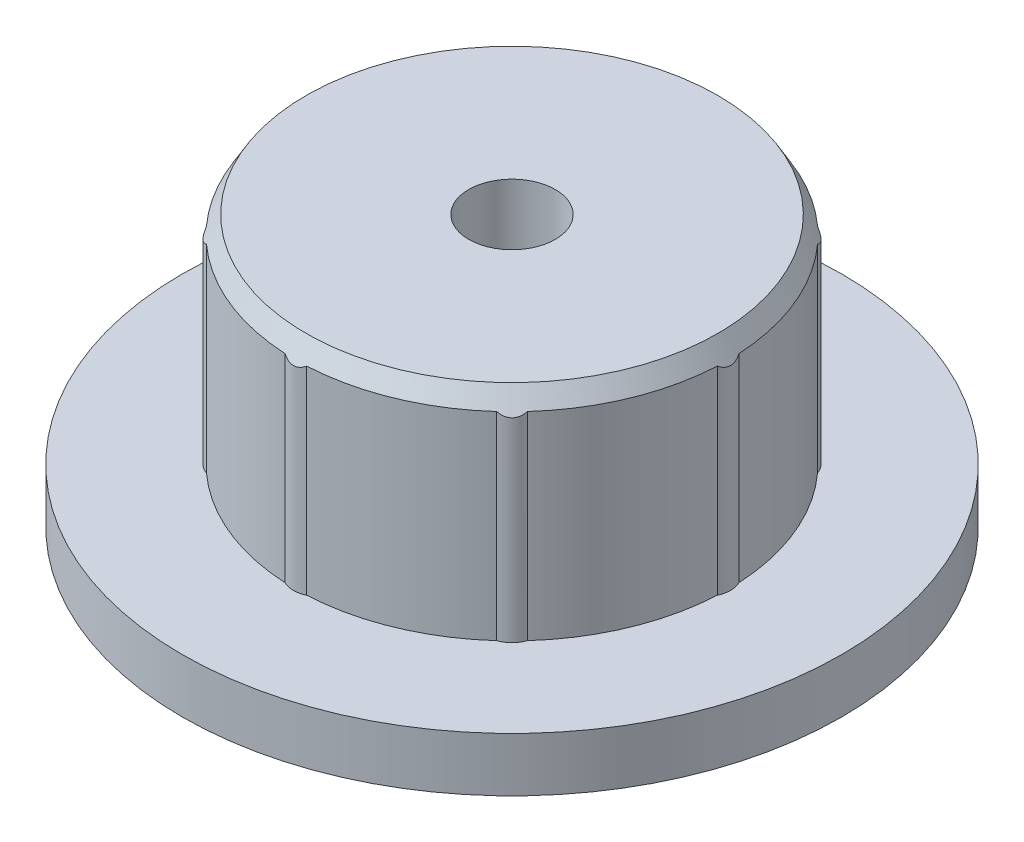
ISO-10303-21;
HEADER;
FILE_DESCRIPTION(('STEP AP214'),'2;1');
FILE_NAME('part.step','',(''),(''),'','','');
FILE_SCHEMA(('AUTOMOTIVE_DESIGN { 1 0 10303 214 1 1 1 1 }'));
ENDSEC;
DATA;
#1=APPLICATION_CONTEXT('core data for automotive mechanical design processes');
#2=APPLICATION_PROTOCOL_DEFINITION('international standard','automotive_design',2000,#1);
#3=PRODUCT_CONTEXT('',#1,'mechanical');
#4=PRODUCT('Part','Part','',(#3));
#5=PRODUCT_RELATED_PRODUCT_CATEGORY('part','',(#4));
#6=PRODUCT_DEFINITION_FORMATION('','',#4);
#7=PRODUCT_DEFINITION_CONTEXT('part definition',#1,'design');
#8=PRODUCT_DEFINITION('design','',#6,#7);
#9=PRODUCT_DEFINITION_SHAPE('','',#8);
#10=(LENGTH_UNIT() NAMED_UNIT(*) SI_UNIT(.MILLI.,.METRE.));
#11=(NAMED_UNIT(*) PLANE_ANGLE_UNIT() SI_UNIT($,.RADIAN.));
#12=(NAMED_UNIT(*) SI_UNIT($,.STERADIAN.) SOLID_ANGLE_UNIT());
#13=UNCERTAINTY_MEASURE_WITH_UNIT(LENGTH_MEASURE(1.E-05),#10,'distance_accuracy_value','');
#14=(GEOMETRIC_REPRESENTATION_CONTEXT(3) GLOBAL_UNCERTAINTY_ASSIGNED_CONTEXT((#13)) GLOBAL_UNIT_ASSIGNED_CONTEXT((#10,
#11,#12)) REPRESENTATION_CONTEXT('',''));
#15=CARTESIAN_POINT('',(0.,0.,0.));
#16=DIRECTION('',(0.,0.,1.));
#17=DIRECTION('',(1.,0.,0.));
#18=AXIS2_PLACEMENT_3D('',#15,#16,#17);
#19=CARTESIAN_POINT('',(0.,20.,-17.8654244589449));
#20=DIRECTION('',(0.,-1.,0.));
#21=DIRECTION('',(0.,0.,-1.));
#22=AXIS2_PLACEMENT_3D('',#19,#20,#21);
#23=CYLINDRICAL_SURFACE('',#22,2.33457554105512);
#24=CARTESIAN_POINT('',(1.00019999999913,18.3465568635732,-19.9748895373225));
#25=CARTESIAN_POINT('',(0.936778937973476,18.3000059783888,-20.0049752769249));
#26=CARTESIAN_POINT('',(0.869869912967122,18.2564678303075,-20.0331776508218));
#27=CARTESIAN_POINT('',(0.728845285712576,18.1772155107456,-20.0845929601786));
#28=CARTESIAN_POINT('',(0.65466279754121,18.1415861811692,-20.107751744946));
#29=CARTESIAN_POINT('',(0.499656897997748,18.0807913397925,-20.1473117926902));
#30=CARTESIAN_POINT('',(0.418791818863089,18.0556985122212,-20.1636661093868));
#31=CARTESIAN_POINT('',(0.253155513709557,18.0187956663927,-20.1877302835464));
#32=CARTESIAN_POINT('',(0.168404458060747,18.0069237028639,-20.1954804544957));
#33=CARTESIAN_POINT('',(0.0054196616133081,17.9980253641132,-20.2012889261277));
#34=CARTESIAN_POINT('',(-0.072718913273675,17.9997660114449,-20.2001521732146));
#35=CARTESIAN_POINT('',(-0.227400467730402,18.015026362725,-20.1901924466268));
#36=CARTESIAN_POINT('',(-0.303941554463938,18.0285593085791,-20.1813608321755));
#37=CARTESIAN_POINT('',(-0.448565408111955,18.0650025949673,-20.1576031639655));
#38=CARTESIAN_POINT('',(-0.516878976354796,18.0872863483881,-20.14308447122));
#39=CARTESIAN_POINT('',(-0.649097768835284,18.1396865669246,-20.1089888452164));
#40=CARTESIAN_POINT('',(-0.713000248564872,18.1698078538274,-20.0894087981738));
#41=CARTESIAN_POINT('',(-0.814192358588953,18.224629572099,-20.053829140502));
#42=CARTESIAN_POINT('',(-0.8529218819037,18.2474973645416,-20.0390008426883));
#43=CARTESIAN_POINT('',(-0.928168459614842,18.2954435604405,-20.0079445847695));
#44=CARTESIAN_POINT('',(-0.964693535656864,18.3205130170817,-19.9917222946856));
#45=CARTESIAN_POINT('',(-1.00019999999913,18.3465568635732,-19.9748895373225));
#46=B_SPLINE_CURVE_WITH_KNOTS('',3,(#24,#25,#26,#27,#28,#29,#30,#31,#32,#33,#34,#35,#36,#37,#38,
#39,#40,#41,#42,#43,#44,#45),.UNSPECIFIED.,.F.,.F.,(4,2,2,2,2,2,2,2,2,2,4),(0.,
0.252982500950508,0.508560159735214,0.765873009849382,1.02197510174111,1.25516824260494,
1.48862358059119,1.70774906628134,1.92700968184791,2.06897077778266,2.21037955587554),.UNSPECIFIED.);
#47=CARTESIAN_POINT('',(0.999999999999992,18.3464101615139,-19.9749843554381));
#48=VERTEX_POINT('',#47);
#49=CARTESIAN_POINT('',(-0.999999999999996,18.3464101615139,-19.9749843554381));
#50=VERTEX_POINT('',#49);
#51=EDGE_CURVE('E178',#48,#50,#46,.T.);
#52=ORIENTED_EDGE('',*,*,#51,.F.);
#53=DIRECTION('',(0.,-1.,0.));
#54=VECTOR('',#53,1.);
#55=CARTESIAN_POINT('',(0.999999999999996,20.,-19.9749843554382));
#56=LINE('',#55,#54);
#57=CARTESIAN_POINT('',(0.999999999999996,0.,-19.9749843554382));
#58=VERTEX_POINT('',#57);
#59=EDGE_CURVE('E175',#48,#58,#56,.T.);
#60=ORIENTED_EDGE('',*,*,#59,.T.);
#61=CARTESIAN_POINT('',(0.,0.,-17.8654244589449));
#62=DIRECTION('',(0.,1.,0.));
#63=DIRECTION('',(0.,0.,-1.));
#64=AXIS2_PLACEMENT_3D('',#61,#62,#63);
#65=CIRCLE('',#64,2.33457554105512);
#66=CARTESIAN_POINT('',(-1.,0.,-19.9749843554382));
#67=VERTEX_POINT('',#66);
#68=EDGE_CURVE('E162',#58,#67,#65,.T.);
#69=ORIENTED_EDGE('',*,*,#68,.T.);
#70=DIRECTION('',(0.,-1.,0.));
#71=VECTOR('',#70,1.);
#72=CARTESIAN_POINT('',(-1.,20.,-19.9749843554382));
#73=LINE('',#72,#71);
#74=EDGE_CURVE('E11',#50,#67,#73,.T.);
#75=ORIENTED_EDGE('',*,*,#74,.F.);
#76=EDGE_LOOP('',(#52,#60,#69,#75));
#77=FACE_BOUND('',#76,.T.);
#78=ADVANCED_FACE('F45',(#77),#23,.T.);
#79=CARTESIAN_POINT('',(0.,20.,0.));
#80=DIRECTION('',(0.,-1.,0.));
#81=DIRECTION('',(0.,0.,-1.));
#82=AXIS2_PLACEMENT_3D('',#79,#80,#81);
#83=CYLINDRICAL_SURFACE('',#82,19.9999999999999);
#84=CARTESIAN_POINT('',(0.,18.3464101615139,0.));
#85=DIRECTION('',(0.,-1.,0.));
#86=DIRECTION('',(0.,0.,-1.));
#87=AXIS2_PLACEMENT_3D('',#84,#85,#86);
#88=CIRCLE('',#87,19.9999999999999);
#89=CARTESIAN_POINT('',(-13.4173401106366,18.3464101615138,-14.8315536730142));
#90=VERTEX_POINT('',#89);
#91=EDGE_CURVE('E171',#50,#90,#88,.F.);
#92=ORIENTED_EDGE('',*,*,#91,.F.);
#93=ORIENTED_EDGE('',*,*,#74,.T.);
#94=CARTESIAN_POINT('',(0.,0.,0.));
#95=DIRECTION('',(0.,1.,0.));
#96=DIRECTION('',(0.,0.,1.));
#97=AXIS2_PLACEMENT_3D('',#94,#95,#96);
#98=CIRCLE('',#97,19.9999999999999);
#99=CARTESIAN_POINT('',(-13.4173401106366,0.,-14.8315536730142));
#100=VERTEX_POINT('',#99);
#101=EDGE_CURVE('E158',#67,#100,#98,.T.);
#102=ORIENTED_EDGE('',*,*,#101,.T.);
#103=DIRECTION('',(0.,-1.,0.));
#104=VECTOR('',#103,1.);
#105=CARTESIAN_POINT('',(-13.4173401106366,20.,-14.8315536730142));
#106=LINE('',#105,#104);
#107=EDGE_CURVE('E55',#90,#100,#106,.T.);
#108=ORIENTED_EDGE('',*,*,#107,.F.);
#109=EDGE_LOOP('',(#92,#93,#102,#108));
#110=FACE_BOUND('',#109,.T.);
#111=ADVANCED_FACE('F170',(#110),#83,.T.);
#112=CARTESIAN_POINT('',(-12.6327627836939,20.,-12.6327627836979));
#113=DIRECTION('',(0.,-1.,0.));
#114=DIRECTION('',(0.,0.,-1.));
#115=AXIS2_PLACEMENT_3D('',#112,#113,#114);
#116=CYLINDRICAL_SURFACE('',#115,2.33457554105512);
#117=CARTESIAN_POINT('',(-13.4171401106366,18.346550904103,-14.8316250271937));
#118=CARTESIAN_POINT('',(-13.4832592181654,18.3000004702781,-14.8080531755039));
#119=CARTESIAN_POINT('',(-13.5505129259065,18.2564627890549,-14.7806832257684));
#120=CARTESIAN_POINT('',(-13.6865880276258,18.17721143041,-14.7173194797423));
#121=CARTESIAN_POINT('',(-13.7554184260658,18.1415825935409,-14.6812400995239));
#122=CARTESIAN_POINT('',(-13.8929967074696,18.080788736583,-14.5996072732304));
#123=CARTESIAN_POINT('',(-13.9617408575345,18.0556964004296,-14.553991168234));
#124=CARTESIAN_POINT('',(-14.0958786122295,18.0187944836107,-14.4538844398695));
#125=CARTESIAN_POINT('',(-14.161286460303,18.0069229586197,-14.3994365840747));
#126=CARTESIAN_POINT('',(-14.2806406071352,17.9980253527672,-14.2882961801287));
#127=CARTESIAN_POINT('',(-14.3350887931541,17.9997663161659,-14.2322400908324));
#128=CARTESIAN_POINT('',(-14.4374219375856,18.0150272075962,-14.1158212676601));
#129=CARTESIAN_POINT('',(-14.4852994473463,18.0285603779082,-14.0554537621875));
#130=CARTESIAN_POINT('',(-14.5707643316058,18.0650040728939,-13.9363900858209));
#131=CARTESIAN_POINT('',(-14.6088029263104,18.0872880532124,-13.877818750809));
#132=CARTESIAN_POINT('',(-14.6781862182997,18.1396887008973,-13.7602165698674));
#133=CARTESIAN_POINT('',(-14.7095267738571,18.1698101892038,-13.7011854628829));
#134=CARTESIAN_POINT('',(-14.7559204914054,18.2246309559625,-13.6044753878771));
#135=CARTESIAN_POINT('',(-14.7728202104609,18.2474974484181,-13.5666064816797));
#136=CARTESIAN_POINT('',(-14.8040657774198,18.2954407950193,-13.4914433419405));
#137=CARTESIAN_POINT('',(-14.8184213051692,18.3205087038386,-13.4541474458409));
#138=CARTESIAN_POINT('',(-14.8316250271894,18.346550904103,-13.4171401106413));
#139=B_SPLINE_CURVE_WITH_KNOTS('',3,(#117,#118,#119,#120,#121,#122,#123,#124,#125,#126,#127,
#128,#129,#130,#131,#132,#133,#134,#135,#136,#137,#138),.UNSPECIFIED.,.F.,.F.,(4,2,2,2,2,2,2,2,
2,2,4),(0.,0.252981494846758,0.508558091303569,0.765869865711038,1.02197090083662,
1.25516332745251,1.48861795986524,1.7077436531247,1.92700445304442,2.06895735807367,
2.21035800679741),.UNSPECIFIED.);
#140=CARTESIAN_POINT('',(-14.8315536730099,18.3464101615138,-13.4173401106413));
#141=VERTEX_POINT('',#140);
#142=EDGE_CURVE('E301',#90,#141,#139,.T.);
#143=ORIENTED_EDGE('',*,*,#142,.F.);
#144=ORIENTED_EDGE('',*,*,#107,.T.);
#145=CARTESIAN_POINT('',(-12.6327627836939,0.,-12.6327627836979));
#146=DIRECTION('',(0.,1.,0.));
#147=DIRECTION('',(0.,0.,-1.));
#148=AXIS2_PLACEMENT_3D('',#145,#146,#147);
#149=CIRCLE('',#148,2.33457554105512);
#150=CARTESIAN_POINT('',(-14.83155367301,0.,-13.4173401106413));
#151=VERTEX_POINT('',#150);
#152=EDGE_CURVE('E70',#100,#151,#149,.T.);
#153=ORIENTED_EDGE('',*,*,#152,.T.);
#154=DIRECTION('',(0.,-1.,0.));
#155=VECTOR('',#154,1.);
#156=CARTESIAN_POINT('',(-14.83155367301,20.,-13.4173401106413));
#157=LINE('',#156,#155);
#158=EDGE_CURVE('E292',#141,#151,#157,.T.);
#159=ORIENTED_EDGE('',*,*,#158,.F.);
#160=EDGE_LOOP('',(#143,#144,#153,#159));
#161=FACE_BOUND('',#160,.T.);
#162=ADVANCED_FACE('F299',(#161),#116,.T.);
#163=CARTESIAN_POINT('',(0.,20.,0.));
#164=DIRECTION('',(0.,-1.,0.));
#165=DIRECTION('',(0.,0.,-1.));
#166=AXIS2_PLACEMENT_3D('',#163,#164,#165);
#167=CYLINDRICAL_SURFACE('',#166,20.);
#168=CARTESIAN_POINT('',(0.,18.3464101615138,0.));
#169=DIRECTION('',(0.,-1.,0.));
#170=DIRECTION('',(0.,0.,-1.));
#171=AXIS2_PLACEMENT_3D('',#168,#169,#170);
#172=CIRCLE('',#171,20.);
#173=CARTESIAN_POINT('',(-19.974984355438,18.3464101615138,-1.00000000000273));
#174=VERTEX_POINT('',#173);
#175=EDGE_CURVE('E304',#141,#174,#172,.F.);
#176=ORIENTED_EDGE('',*,*,#175,.F.);
#177=ORIENTED_EDGE('',*,*,#158,.T.);
#178=CARTESIAN_POINT('',(0.,0.,0.));
#179=DIRECTION('',(0.,1.,0.));
#180=DIRECTION('',(0.,0.,1.));
#181=AXIS2_PLACEMENT_3D('',#178,#179,#180);
#182=CIRCLE('',#181,20.);
#183=CARTESIAN_POINT('',(-19.974984355438,0.,-1.00000000000271));
#184=VERTEX_POINT('',#183);
#185=EDGE_CURVE('E191',#151,#184,#182,.T.);
#186=ORIENTED_EDGE('',*,*,#185,.T.);
#187=DIRECTION('',(0.,-1.,0.));
#188=VECTOR('',#187,1.);
#189=CARTESIAN_POINT('',(-19.974984355438,20.,-1.00000000000271));
#190=LINE('',#189,#188);
#191=EDGE_CURVE('E288',#174,#184,#190,.T.);
#192=ORIENTED_EDGE('',*,*,#191,.F.);
#193=EDGE_LOOP('',(#176,#177,#186,#192));
#194=FACE_BOUND('',#193,.T.);
#195=ADVANCED_FACE('F388',(#194),#167,.T.);
#196=CARTESIAN_POINT('',(-17.8654244589449,20.,-2.42447389764044E-12));
#197=DIRECTION('',(0.,-1.,0.));
#198=DIRECTION('',(0.,0.,-1.));
#199=AXIS2_PLACEMENT_3D('',#196,#197,#198);
#200=CYLINDRICAL_SURFACE('',#199,2.33457554105513);
#201=CARTESIAN_POINT('',(-19.9748895373223,18.3465568635732,-1.00020000000184));
#202=CARTESIAN_POINT('',(-20.0049752769248,18.3000059783888,-0.936778937976192));
#203=CARTESIAN_POINT('',(-20.0331776508217,18.2564678303075,-0.869869912969841));
#204=CARTESIAN_POINT('',(-20.0845929601785,18.1772155107456,-0.7288452857153));
#205=CARTESIAN_POINT('',(-20.1077517449459,18.1415861811692,-0.654662797543937));
#206=CARTESIAN_POINT('',(-20.1473117926902,18.0807913397925,-0.499656898000481));
#207=CARTESIAN_POINT('',(-20.1636661093867,18.0556985122212,-0.418791818865824));
#208=CARTESIAN_POINT('',(-20.1877302835464,18.0187956663927,-0.253155513712298));
#209=CARTESIAN_POINT('',(-20.1954804544956,18.0069237028639,-0.16840445806349));
#210=CARTESIAN_POINT('',(-20.2012889261277,17.9980253641132,-0.0054196616160514));
#211=CARTESIAN_POINT('',(-20.2001521732147,17.9997660114449,0.0727189132709334));
#212=CARTESIAN_POINT('',(-20.1901924466269,18.015026362725,0.227400467727663));
#213=CARTESIAN_POINT('',(-20.1813608321755,18.0285593085791,0.3039415544612));
#214=CARTESIAN_POINT('',(-20.1576031639656,18.0650025949673,0.448565408109222));
#215=CARTESIAN_POINT('',(-20.1430844712201,18.0872863483881,0.516878976352067));
#216=CARTESIAN_POINT('',(-20.1089888452165,18.1396865669246,0.64909776883256));
#217=CARTESIAN_POINT('',(-20.0894087981739,18.1698078538274,0.713000248562147));
#218=CARTESIAN_POINT('',(-20.0538291405021,18.224629572099,0.814192358586233));
#219=CARTESIAN_POINT('',(-20.0390008426885,18.2474973645416,0.852921881900983));
#220=CARTESIAN_POINT('',(-20.0079445847696,18.2954435604405,0.92816845961213));
#221=CARTESIAN_POINT('',(-19.9917222946857,18.3205130170817,0.964693535654154));
#222=CARTESIAN_POINT('',(-19.9748895373226,18.3465568635732,1.00019999999642));
#223=B_SPLINE_CURVE_WITH_KNOTS('',3,(#201,#202,#203,#204,#205,#206,#207,#208,#209,#210,#211,
#212,#213,#214,#215,#216,#217,#218,#219,#220,#221,#222),.UNSPECIFIED.,.F.,.F.,(4,2,2,2,2,2,2,2,
2,2,4),(0.,0.252982500950511,0.508560159735215,0.765873009849384,1.02197510174111,
1.25516824260494,1.48862358059119,1.70774906628135,1.92700968184792,2.06897077778266,
2.21037955587555),.UNSPECIFIED.);
#224=CARTESIAN_POINT('',(-19.9749843554383,18.3464101615137,0.999999999997294));
#225=VERTEX_POINT('',#224);
#226=EDGE_CURVE('E308',#174,#225,#223,.T.);
#227=ORIENTED_EDGE('',*,*,#226,.F.);
#228=ORIENTED_EDGE('',*,*,#191,.T.);
#229=CARTESIAN_POINT('',(-17.8654244589449,0.,-2.42447389764044E-12));
#230=DIRECTION('',(0.,1.,0.));
#231=DIRECTION('',(0.,0.,-1.));
#232=AXIS2_PLACEMENT_3D('',#229,#230,#231);
#233=CIRCLE('',#232,2.33457554105513);
#234=CARTESIAN_POINT('',(-19.9749843554383,0.,0.999999999997293));
#235=VERTEX_POINT('',#234);
#236=EDGE_CURVE('E195',#184,#235,#233,.T.);
#237=ORIENTED_EDGE('',*,*,#236,.T.);
#238=DIRECTION('',(0.,-1.,0.));
#239=VECTOR('',#238,1.);
#240=CARTESIAN_POINT('',(-19.9749843554383,20.,0.999999999997293));
#241=LINE('',#240,#239);
#242=EDGE_CURVE('E284',#225,#235,#241,.T.);
#243=ORIENTED_EDGE('',*,*,#242,.F.);
#244=EDGE_LOOP('',(#227,#228,#237,#243));
#245=FACE_BOUND('',#244,.T.);
#246=ADVANCED_FACE('F383',(#245),#200,.T.);
#247=CARTESIAN_POINT('',(0.,20.,0.));
#248=DIRECTION('',(0.,-1.,0.));
#249=DIRECTION('',(0.,0.,-1.));
#250=AXIS2_PLACEMENT_3D('',#247,#248,#249);
#251=CYLINDRICAL_SURFACE('',#250,20.);
#252=CARTESIAN_POINT('',(0.,18.3464101615137,0.));
#253=DIRECTION('',(0.,-1.,0.));
#254=DIRECTION('',(0.,0.,-1.));
#255=AXIS2_PLACEMENT_3D('',#252,#253,#254);
#256=CIRCLE('',#255,20.);
#257=CARTESIAN_POINT('',(-14.8315536730136,18.3464101615138,13.4173401106373));
#258=VERTEX_POINT('',#257);
#259=EDGE_CURVE('E382',#225,#258,#256,.F.);
#260=ORIENTED_EDGE('',*,*,#259,.F.);
#261=ORIENTED_EDGE('',*,*,#242,.T.);
#262=CARTESIAN_POINT('',(0.,0.,0.));
#263=DIRECTION('',(0.,1.,0.));
#264=DIRECTION('',(0.,0.,1.));
#265=AXIS2_PLACEMENT_3D('',#262,#263,#264);
#266=CIRCLE('',#265,20.);
#267=CARTESIAN_POINT('',(-14.8315536730136,0.,13.4173401106373));
#268=VERTEX_POINT('',#267);
#269=EDGE_CURVE('E199',#235,#268,#266,.T.);
#270=ORIENTED_EDGE('',*,*,#269,.T.);
#271=DIRECTION('',(0.,-1.,0.));
#272=VECTOR('',#271,1.);
#273=CARTESIAN_POINT('',(-14.8315536730136,20.,13.4173401106373));
#274=LINE('',#273,#272);
#275=EDGE_CURVE('E280',#258,#268,#274,.T.);
#276=ORIENTED_EDGE('',*,*,#275,.F.);
#277=EDGE_LOOP('',(#260,#261,#270,#276));
#278=FACE_BOUND('',#277,.T.);
#279=ADVANCED_FACE('F387',(#278),#251,.T.);
#280=CARTESIAN_POINT('',(-12.6327627836974,20.,12.6327627836945));
#281=DIRECTION('',(0.,-1.,0.));
#282=DIRECTION('',(0.,0.,-1.));
#283=AXIS2_PLACEMENT_3D('',#280,#281,#282);
#284=CYLINDRICAL_SURFACE('',#283,2.33457554105512);
#285=CARTESIAN_POINT('',(-14.8316250271931,18.346550904103,13.4171401106373));
#286=CARTESIAN_POINT('',(-14.8080531755033,18.3000004702781,13.4832592181661));
#287=CARTESIAN_POINT('',(-14.7806832257678,18.2564627890549,13.5505129259072));
#288=CARTESIAN_POINT('',(-14.7173194797417,18.17721143041,13.6865880276264));
#289=CARTESIAN_POINT('',(-14.6812400995232,18.1415825935409,13.7554184260664));
#290=CARTESIAN_POINT('',(-14.5996072732298,18.080788736583,13.8929967074702));
#291=CARTESIAN_POINT('',(-14.5539911682334,18.0556964004296,13.9617408575351));
#292=CARTESIAN_POINT('',(-14.4538844398688,18.0187944836107,14.0958786122301));
#293=CARTESIAN_POINT('',(-14.3994365840741,18.0069229586197,14.1612864603037));
#294=CARTESIAN_POINT('',(-14.2882961801281,17.9980253527672,14.2806406071359));
#295=CARTESIAN_POINT('',(-14.2322400908317,17.9997663161659,14.3350887931548));
#296=CARTESIAN_POINT('',(-14.1158212676595,18.0150272075962,14.4374219375863));
#297=CARTESIAN_POINT('',(-14.0554537621868,18.0285603779082,14.4852994473469));
#298=CARTESIAN_POINT('',(-13.9363900858203,18.0650040728939,14.5707643316064));
#299=CARTESIAN_POINT('',(-13.8778187508084,18.0872880532124,14.608802926311));
#300=CARTESIAN_POINT('',(-13.7602165698667,18.1396887008973,14.6781862183003));
#301=CARTESIAN_POINT('',(-13.7011854628822,18.1698101892038,14.7095267738578));
#302=CARTESIAN_POINT('',(-13.6044753878764,18.2246309559625,14.755920491406));
#303=CARTESIAN_POINT('',(-13.566606481679,18.2474974484181,14.7728202104615));
#304=CARTESIAN_POINT('',(-13.4914433419399,18.2954407950193,14.8040657774204));
#305=CARTESIAN_POINT('',(-13.4541474458402,18.3205087038386,14.8184213051698));
#306=CARTESIAN_POINT('',(-13.4171401106407,18.346550904103,14.83162502719));
#307=B_SPLINE_CURVE_WITH_KNOTS('',3,(#285,#286,#287,#288,#289,#290,#291,#292,#293,#294,#295,
#296,#297,#298,#299,#300,#301,#302,#303,#304,#305,#306),.UNSPECIFIED.,.F.,.F.,(4,2,2,2,2,2,2,2,
2,2,4),(0.,0.252981494846754,0.50855809130357,0.765869865711041,1.02197090083662,
1.25516332745252,1.48861795986524,1.70774365312471,1.92700445304443,2.06895735807368,
2.21035800679743),.UNSPECIFIED.);
#308=CARTESIAN_POINT('',(-13.4173401106407,18.3464101615137,14.8315536730106));
#309=VERTEX_POINT('',#308);
#310=EDGE_CURVE('E369',#258,#309,#307,.T.);
#311=ORIENTED_EDGE('',*,*,#310,.F.);
#312=ORIENTED_EDGE('',*,*,#275,.T.);
#313=CARTESIAN_POINT('',(-12.6327627836974,0.,12.6327627836945));
#314=DIRECTION('',(0.,1.,0.));
#315=DIRECTION('',(0.,0.,-1.));
#316=AXIS2_PLACEMENT_3D('',#313,#314,#315);
#317=CIRCLE('',#316,2.33457554105512);
#318=CARTESIAN_POINT('',(-13.4173401106407,0.,14.8315536730106));
#319=VERTEX_POINT('',#318);
#320=EDGE_CURVE('E203',#268,#319,#317,.T.);
#321=ORIENTED_EDGE('',*,*,#320,.T.);
#322=DIRECTION('',(0.,-1.,0.));
#323=VECTOR('',#322,1.);
#324=CARTESIAN_POINT('',(-13.4173401106407,20.,14.8315536730106));
#325=LINE('',#324,#323);
#326=EDGE_CURVE('E276',#309,#319,#325,.T.);
#327=ORIENTED_EDGE('',*,*,#326,.F.);
#328=EDGE_LOOP('',(#311,#312,#321,#327));
#329=FACE_BOUND('',#328,.T.);
#330=ADVANCED_FACE('F424',(#329),#284,.T.);
#331=CARTESIAN_POINT('',(0.,20.,0.));
#332=DIRECTION('',(0.,-1.,0.));
#333=DIRECTION('',(0.,0.,-1.));
#334=AXIS2_PLACEMENT_3D('',#331,#332,#333);
#335=CYLINDRICAL_SURFACE('',#334,20.0000000000001);
#336=CARTESIAN_POINT('',(0.,18.3464101615137,0.));
#337=DIRECTION('',(0.,-1.,0.));
#338=DIRECTION('',(0.,0.,-1.));
#339=AXIS2_PLACEMENT_3D('',#336,#337,#338);
#340=CIRCLE('',#339,20.0000000000001);
#341=CARTESIAN_POINT('',(-1.00000000000182,18.3464101615138,19.9749843554381));
#342=VERTEX_POINT('',#341);
#343=EDGE_CURVE('E617',#309,#342,#340,.F.);
#344=ORIENTED_EDGE('',*,*,#343,.F.);
#345=ORIENTED_EDGE('',*,*,#326,.T.);
#346=CARTESIAN_POINT('',(0.,0.,0.));
#347=DIRECTION('',(0.,1.,0.));
#348=DIRECTION('',(0.,0.,1.));
#349=AXIS2_PLACEMENT_3D('',#346,#347,#348);
#350=CIRCLE('',#349,20.0000000000001);
#351=CARTESIAN_POINT('',(-1.00000000000181,0.,19.9749843554381));
#352=VERTEX_POINT('',#351);
#353=EDGE_CURVE('E207',#319,#352,#350,.T.);
#354=ORIENTED_EDGE('',*,*,#353,.T.);
#355=DIRECTION('',(0.,-1.,0.));
#356=VECTOR('',#355,1.);
#357=CARTESIAN_POINT('',(-1.00000000000181,20.,19.9749843554381));
#358=LINE('',#357,#356);
#359=EDGE_CURVE('E272',#342,#352,#358,.T.);
#360=ORIENTED_EDGE('',*,*,#359,.F.);
#361=EDGE_LOOP('',(#344,#345,#354,#360));
#362=FACE_BOUND('',#361,.T.);
#363=ADVANCED_FACE('F433',(#362),#335,.T.);
#364=CARTESIAN_POINT('',(-1.61631593176029E-12,20.,17.8654244589449));
#365=DIRECTION('',(0.,-1.,0.));
#366=DIRECTION('',(0.,0.,-1.));
#367=AXIS2_PLACEMENT_3D('',#364,#365,#366);
#368=CYLINDRICAL_SURFACE('',#367,2.33457554105512);
#369=CARTESIAN_POINT('',(-1.00020000000093,18.3465568635732,19.9748895373224));
#370=CARTESIAN_POINT('',(-0.936778937975285,18.3000059783888,20.0049752769248));
#371=CARTESIAN_POINT('',(-0.869869912968934,18.2564678303075,20.0331776508217));
#372=CARTESIAN_POINT('',(-0.728845285714392,18.1772155107456,20.0845929601785));
#373=CARTESIAN_POINT('',(-0.654662797543029,18.1415861811692,20.107751744946));
#374=CARTESIAN_POINT('',(-0.49965689799957,18.0807913397925,20.1473117926902));
#375=CARTESIAN_POINT('',(-0.41879181886491,18.0556985122212,20.1636661093867));
#376=CARTESIAN_POINT('',(-0.253155513711379,18.0187956663927,20.1877302835464));
#377=CARTESIAN_POINT('',(-0.16840445806257,18.0069237028639,20.1954804544956));
#378=CARTESIAN_POINT('',(-0.00541966161513067,17.9980253641132,20.2012889261277));
#379=CARTESIAN_POINT('',(0.0727189132718529,17.9997660114449,20.2001521732146));
#380=CARTESIAN_POINT('',(0.22740046772858,18.015026362725,20.1901924466269));
#381=CARTESIAN_POINT('',(0.303941554462116,18.0285593085791,20.1813608321755));
#382=CARTESIAN_POINT('',(0.448565408110135,18.0650025949673,20.1576031639656));
#383=CARTESIAN_POINT('',(0.516878976352978,18.0872863483881,20.14308447122));
#384=CARTESIAN_POINT('',(0.649097768833468,18.1396865669246,20.1089888452164));
#385=CARTESIAN_POINT('',(0.713000248563056,18.1698078538274,20.0894087981738));
#386=CARTESIAN_POINT('',(0.814192358587141,18.224629572099,20.0538291405021));
#387=CARTESIAN_POINT('',(0.852921881901891,18.2474973645416,20.0390008426884));
#388=CARTESIAN_POINT('',(0.928168459613038,18.2954435604405,20.0079445847695));
#389=CARTESIAN_POINT('',(0.964693535655061,18.3205130170817,19.9917222946857));
#390=CARTESIAN_POINT('',(1.00019999999733,18.3465568635732,19.9748895373226));
#391=B_SPLINE_CURVE_WITH_KNOTS('',3,(#369,#370,#371,#372,#373,#374,#375,#376,#377,#378,#379,
#380,#381,#382,#383,#384,#385,#386,#387,#388,#389,#390),.UNSPECIFIED.,.F.,.F.,(4,2,2,2,2,2,2,2,
2,2,4),(0.,0.252982500950515,0.508560159735218,0.765873009849387,1.02197510174112,
1.25516824260495,1.48862358059119,1.70774906628135,1.92700968184792,2.06897077778267,
2.21037955587555),.UNSPECIFIED.);
#392=CARTESIAN_POINT('',(0.999999999998199,18.3464101615136,19.9749843554383));
#393=VERTEX_POINT('',#392);
#394=EDGE_CURVE('E360',#342,#393,#391,.T.);
#395=ORIENTED_EDGE('',*,*,#394,.F.);
#396=ORIENTED_EDGE('',*,*,#359,.T.);
#397=CARTESIAN_POINT('',(-1.61631593176029E-12,0.,17.8654244589449));
#398=DIRECTION('',(0.,1.,0.));
#399=DIRECTION('',(0.,0.,-1.));
#400=AXIS2_PLACEMENT_3D('',#397,#398,#399);
#401=CIRCLE('',#400,2.33457554105512);
#402=CARTESIAN_POINT('',(0.999999999998195,0.,19.9749843554383));
#403=VERTEX_POINT('',#402);
#404=EDGE_CURVE('E211',#352,#403,#401,.T.);
#405=ORIENTED_EDGE('',*,*,#404,.T.);
#406=DIRECTION('',(0.,-1.,0.));
#407=VECTOR('',#406,1.);
#408=CARTESIAN_POINT('',(0.999999999998195,20.,19.9749843554383));
#409=LINE('',#408,#407);
#410=EDGE_CURVE('E268',#393,#403,#409,.T.);
#411=ORIENTED_EDGE('',*,*,#410,.F.);
#412=EDGE_LOOP('',(#395,#396,#405,#411));
#413=FACE_BOUND('',#412,.T.);
#414=ADVANCED_FACE('F442',(#413),#368,.T.);
#415=CARTESIAN_POINT('',(0.,20.,0.));
#416=DIRECTION('',(0.,-1.,0.));
#417=DIRECTION('',(0.,0.,-1.));
#418=AXIS2_PLACEMENT_3D('',#415,#416,#417);
#419=CYLINDRICAL_SURFACE('',#418,20.0000000000001);
#420=CARTESIAN_POINT('',(0.,18.3464101615136,0.));
#421=DIRECTION('',(0.,-1.,0.));
#422=DIRECTION('',(0.,0.,-1.));
#423=AXIS2_PLACEMENT_3D('',#420,#421,#422);
#424=CIRCLE('',#423,20.0000000000001);
#425=CARTESIAN_POINT('',(13.417340110638,18.3464101615138,14.831553673013));
#426=VERTEX_POINT('',#425);
#427=EDGE_CURVE('E628',#393,#426,#424,.F.);
#428=ORIENTED_EDGE('',*,*,#427,.F.);
#429=ORIENTED_EDGE('',*,*,#410,.T.);
#430=CARTESIAN_POINT('',(0.,0.,0.));
#431=DIRECTION('',(0.,1.,0.));
#432=DIRECTION('',(0.,0.,1.));
#433=AXIS2_PLACEMENT_3D('',#430,#431,#432);
#434=CIRCLE('',#433,20.0000000000001);
#435=CARTESIAN_POINT('',(13.417340110638,0.,14.831553673013));
#436=VERTEX_POINT('',#435);
#437=EDGE_CURVE('E215',#403,#436,#434,.T.);
#438=ORIENTED_EDGE('',*,*,#437,.T.);
#439=DIRECTION('',(0.,-1.,0.));
#440=VECTOR('',#439,1.);
#441=CARTESIAN_POINT('',(13.417340110638,20.,14.831553673013));
#442=LINE('',#441,#440);
#443=EDGE_CURVE('E264',#426,#436,#442,.T.);
#444=ORIENTED_EDGE('',*,*,#443,.F.);
#445=EDGE_LOOP('',(#428,#429,#438,#444));
#446=FACE_BOUND('',#445,.T.);
#447=ADVANCED_FACE('F452',(#446),#419,.T.);
#448=CARTESIAN_POINT('',(12.6327627836951,20.,12.6327627836968));
#449=DIRECTION('',(0.,-1.,0.));
#450=DIRECTION('',(0.,0.,-1.));
#451=AXIS2_PLACEMENT_3D('',#448,#449,#450);
#452=CYLINDRICAL_SURFACE('',#451,2.33457554105513);
#453=CARTESIAN_POINT('',(13.417140110638,18.346550904103,14.8316250271924));
#454=CARTESIAN_POINT('',(13.4832592181668,18.3000004702781,14.8080531755027));
#455=CARTESIAN_POINT('',(13.5505129259079,18.2564627890549,14.7806832257672));
#456=CARTESIAN_POINT('',(13.6865880276271,18.17721143041,14.7173194797411));
#457=CARTESIAN_POINT('',(13.7554184260671,18.1415825935408,14.6812400995226));
#458=CARTESIAN_POINT('',(13.8929967074709,18.080788736583,14.5996072732291));
#459=CARTESIAN_POINT('',(13.9617408575358,18.0556964004296,14.5539911682327));
#460=CARTESIAN_POINT('',(14.0958786122308,18.0187944836107,14.4538844398682));
#461=CARTESIAN_POINT('',(14.1612864603044,18.0069229586197,14.3994365840734));
#462=CARTESIAN_POINT('',(14.2806406071365,17.9980253527672,14.2882961801274));
#463=CARTESIAN_POINT('',(14.3350887931554,17.9997663161659,14.2322400908311));
#464=CARTESIAN_POINT('',(14.4374219375869,18.0150272075962,14.1158212676588));
#465=CARTESIAN_POINT('',(14.4852994473476,18.0285603779082,14.0554537621862));
#466=CARTESIAN_POINT('',(14.5707643316071,18.0650040728939,13.9363900858196));
#467=CARTESIAN_POINT('',(14.6088029263117,18.0872880532124,13.8778187508077));
#468=CARTESIAN_POINT('',(14.6781862183009,18.1396887008973,13.7602165698661));
#469=CARTESIAN_POINT('',(14.7095267738584,18.1698101892038,13.7011854628815));
#470=CARTESIAN_POINT('',(14.7559204914067,18.2246309559625,13.6044753878757));
#471=CARTESIAN_POINT('',(14.7728202104621,18.2474974484181,13.5666064816783));
#472=CARTESIAN_POINT('',(14.804065777421,18.2954407950193,13.4914433419392));
#473=CARTESIAN_POINT('',(14.8184213051704,18.3205087038386,13.4541474458395));
#474=CARTESIAN_POINT('',(14.8316250271906,18.346550904103,13.41714011064));
#475=B_SPLINE_CURVE_WITH_KNOTS('',3,(#453,#454,#455,#456,#457,#458,#459,#460,#461,#462,#463,
#464,#465,#466,#467,#468,#469,#470,#471,#472,#473,#474),.UNSPECIFIED.,.F.,.F.,(4,2,2,2,2,2,2,2,
2,2,4),(0.,0.252981494846756,0.508558091303566,0.765869865711033,1.02197090083661,
1.2551633274525,1.48861795986523,1.70774365312469,1.92700445304441,2.06895735807365,
2.21035800679739),.UNSPECIFIED.);
#476=CARTESIAN_POINT('',(14.8315536730112,18.3464101615137,13.41734011064));
#477=VERTEX_POINT('',#476);
#478=EDGE_CURVE('E351',#426,#477,#475,.T.);
#479=ORIENTED_EDGE('',*,*,#478,.F.);
#480=ORIENTED_EDGE('',*,*,#443,.T.);
#481=CARTESIAN_POINT('',(12.6327627836951,0.,12.6327627836968));
#482=DIRECTION('',(0.,1.,0.));
#483=DIRECTION('',(0.,0.,-1.));
#484=AXIS2_PLACEMENT_3D('',#481,#482,#483);
#485=CIRCLE('',#484,2.33457554105513);
#486=CARTESIAN_POINT('',(14.8315536730112,0.,13.41734011064));
#487=VERTEX_POINT('',#486);
#488=EDGE_CURVE('E219',#436,#487,#485,.T.);
#489=ORIENTED_EDGE('',*,*,#488,.T.);
#490=DIRECTION('',(0.,-1.,0.));
#491=VECTOR('',#490,1.);
#492=CARTESIAN_POINT('',(14.8315536730112,20.,13.41734011064));
#493=LINE('',#492,#491);
#494=EDGE_CURVE('E260',#477,#487,#493,.T.);
#495=ORIENTED_EDGE('',*,*,#494,.F.);
#496=EDGE_LOOP('',(#479,#480,#489,#495));
#497=FACE_BOUND('',#496,.T.);
#498=ADVANCED_FACE('F461',(#497),#452,.T.);
#499=CARTESIAN_POINT('',(0.,20.,0.));
#500=DIRECTION('',(0.,-1.,0.));
#501=DIRECTION('',(0.,0.,-1.));
#502=AXIS2_PLACEMENT_3D('',#499,#500,#501);
#503=CYLINDRICAL_SURFACE('',#502,20.);
#504=CARTESIAN_POINT('',(0.,18.3464101615137,0.));
#505=DIRECTION('',(0.,-1.,0.));
#506=DIRECTION('',(0.,0.,-1.));
#507=AXIS2_PLACEMENT_3D('',#504,#505,#506);
#508=CIRCLE('',#507,20.);
#509=CARTESIAN_POINT('',(19.9749843554381,18.3464101615137,1.00000000000087));
#510=VERTEX_POINT('',#509);
#511=EDGE_CURVE('E608',#477,#510,#508,.F.);
#512=ORIENTED_EDGE('',*,*,#511,.F.);
#513=ORIENTED_EDGE('',*,*,#494,.T.);
#514=CARTESIAN_POINT('',(0.,0.,0.));
#515=DIRECTION('',(0.,1.,0.));
#516=DIRECTION('',(0.,0.,1.));
#517=AXIS2_PLACEMENT_3D('',#514,#515,#516);
#518=CIRCLE('',#517,20.);
#519=CARTESIAN_POINT('',(19.9749843554382,0.,1.0000000000009));
#520=VERTEX_POINT('',#519);
#521=EDGE_CURVE('E223',#487,#520,#518,.T.);
#522=ORIENTED_EDGE('',*,*,#521,.T.);
#523=DIRECTION('',(0.,-1.,0.));
#524=VECTOR('',#523,1.);
#525=CARTESIAN_POINT('',(19.9749843554382,20.,1.0000000000009));
#526=LINE('',#525,#524);
#527=EDGE_CURVE('E256',#510,#520,#526,.T.);
#528=ORIENTED_EDGE('',*,*,#527,.F.);
#529=EDGE_LOOP('',(#512,#513,#522,#528));
#530=FACE_BOUND('',#529,.T.);
#531=ADVANCED_FACE('F471',(#530),#503,.T.);
#532=CARTESIAN_POINT('',(17.8654244589449,20.,8.08157965880146E-13));
#533=DIRECTION('',(0.,-1.,0.));
#534=DIRECTION('',(0.,0.,-1.));
#535=AXIS2_PLACEMENT_3D('',#532,#533,#534);
#536=CYLINDRICAL_SURFACE('',#535,2.33457554105513);
#537=CARTESIAN_POINT('',(19.9748895373224,18.3465568635732,1.00020000000003));
#538=CARTESIAN_POINT('',(20.0049752769249,18.3000059783888,0.936778937974379));
#539=CARTESIAN_POINT('',(20.0331776508218,18.2564678303075,0.869869912968026));
#540=CARTESIAN_POINT('',(20.0845929601786,18.1772155107456,0.728845285713481));
#541=CARTESIAN_POINT('',(20.107751744946,18.1415861811692,0.654662797542117));
#542=CARTESIAN_POINT('',(20.1473117926902,18.0807913397925,0.499656897998657));
#543=CARTESIAN_POINT('',(20.1636661093868,18.0556985122212,0.418791818863998));
#544=CARTESIAN_POINT('',(20.1877302835464,18.0187956663927,0.253155513710468));
#545=CARTESIAN_POINT('',(20.1954804544957,18.0069237028639,0.168404458061658));
#546=CARTESIAN_POINT('',(20.2012889261277,17.9980253641132,0.00541966161421903));
#547=CARTESIAN_POINT('',(20.2001521732146,17.9997660114449,-0.0727189132727644));
#548=CARTESIAN_POINT('',(20.1901924466269,18.015026362725,-0.227400467729491));
#549=CARTESIAN_POINT('',(20.1813608321755,18.0285593085791,-0.303941554463027));
#550=CARTESIAN_POINT('',(20.1576031639655,18.0650025949673,-0.448565408111046));
#551=CARTESIAN_POINT('',(20.14308447122,18.0872863483881,-0.516878976353889));
#552=CARTESIAN_POINT('',(20.1089888452164,18.1396865669246,-0.649097768834379));
#553=CARTESIAN_POINT('',(20.0894087981738,18.1698078538274,-0.713000248563968));
#554=CARTESIAN_POINT('',(20.0538291405021,18.224629572099,-0.81419235858805));
#555=CARTESIAN_POINT('',(20.0390008426884,18.2474973645416,-0.852921881902797));
#556=CARTESIAN_POINT('',(20.0079445847695,18.2954435604405,-0.928168459613942));
#557=CARTESIAN_POINT('',(19.9917222946857,18.3205130170817,-0.964693535655965));
#558=CARTESIAN_POINT('',(19.9748895373225,18.3465568635732,-1.00019999999823));
#559=B_SPLINE_CURVE_WITH_KNOTS('',3,(#537,#538,#539,#540,#541,#542,#543,#544,#545,#546,#547,
#548,#549,#550,#551,#552,#553,#554,#555,#556,#557,#558),.UNSPECIFIED.,.F.,.F.,(4,2,2,2,2,2,2,2,
2,2,4),(0.,0.252982500950513,0.508560159735215,0.765873009849382,1.02197510174111,
1.25516824260494,1.48862358059119,1.70774906628134,1.92700968184791,2.06897077778266,
2.21037955587555),.UNSPECIFIED.);
#560=CARTESIAN_POINT('',(19.9749843554382,18.3464101615138,-0.999999999999099));
#561=VERTEX_POINT('',#560);
#562=EDGE_CURVE('E342',#510,#561,#559,.T.);
#563=ORIENTED_EDGE('',*,*,#562,.F.);
#564=ORIENTED_EDGE('',*,*,#527,.T.);
#565=CARTESIAN_POINT('',(17.8654244589449,0.,8.08157965880146E-13));
#566=DIRECTION('',(0.,1.,0.));
#567=DIRECTION('',(0.,0.,-1.));
#568=AXIS2_PLACEMENT_3D('',#565,#566,#567);
#569=CIRCLE('',#568,2.33457554105513);
#570=CARTESIAN_POINT('',(19.9749843554382,0.,-0.9999999999991));
#571=VERTEX_POINT('',#570);
#572=EDGE_CURVE('E227',#520,#571,#569,.T.);
#573=ORIENTED_EDGE('',*,*,#572,.T.);
#574=DIRECTION('',(0.,-1.,0.));
#575=VECTOR('',#574,1.);
#576=CARTESIAN_POINT('',(19.9749843554382,20.,-0.9999999999991));
#577=LINE('',#576,#575);
#578=EDGE_CURVE('E252',#561,#571,#577,.T.);
#579=ORIENTED_EDGE('',*,*,#578,.F.);
#580=EDGE_LOOP('',(#563,#564,#573,#579));
#581=FACE_BOUND('',#580,.T.);
#582=ADVANCED_FACE('F480',(#581),#536,.T.);
#583=CARTESIAN_POINT('',(0.,20.,0.));
#584=DIRECTION('',(0.,-1.,0.));
#585=DIRECTION('',(0.,0.,-1.));
#586=AXIS2_PLACEMENT_3D('',#583,#584,#585);
#587=CYLINDRICAL_SURFACE('',#586,20.);
#588=CARTESIAN_POINT('',(0.,18.3464101615138,0.));
#589=DIRECTION('',(0.,-1.,0.));
#590=DIRECTION('',(0.,0.,-1.));
#591=AXIS2_PLACEMENT_3D('',#588,#589,#590);
#592=CIRCLE('',#591,20.);
#593=CARTESIAN_POINT('',(14.8315536730124,18.3464101615137,-13.4173401106387));
#594=VERTEX_POINT('',#593);
#595=EDGE_CURVE('E596',#561,#594,#592,.F.);
#596=ORIENTED_EDGE('',*,*,#595,.F.);
#597=ORIENTED_EDGE('',*,*,#578,.T.);
#598=CARTESIAN_POINT('',(0.,0.,0.));
#599=DIRECTION('',(0.,1.,0.));
#600=DIRECTION('',(0.,0.,1.));
#601=AXIS2_PLACEMENT_3D('',#598,#599,#600);
#602=CIRCLE('',#601,20.);
#603=CARTESIAN_POINT('',(14.8315536730124,0.,-13.4173401106387));
#604=VERTEX_POINT('',#603);
#605=EDGE_CURVE('E231',#571,#604,#602,.T.);
#606=ORIENTED_EDGE('',*,*,#605,.T.);
#607=DIRECTION('',(0.,-1.,0.));
#608=VECTOR('',#607,1.);
#609=CARTESIAN_POINT('',(14.8315536730124,20.,-13.4173401106387));
#610=LINE('',#609,#608);
#611=EDGE_CURVE('E248',#594,#604,#610,.T.);
#612=ORIENTED_EDGE('',*,*,#611,.F.);
#613=EDGE_LOOP('',(#596,#597,#606,#612));
#614=FACE_BOUND('',#613,.T.);
#615=ADVANCED_FACE('F490',(#614),#587,.T.);
#616=CARTESIAN_POINT('',(12.6327627836962,20.,-12.6327627836956));
#617=DIRECTION('',(0.,-1.,0.));
#618=DIRECTION('',(0.,0.,-1.));
#619=AXIS2_PLACEMENT_3D('',#616,#617,#618);
#620=CYLINDRICAL_SURFACE('',#619,2.33457554105513);
#621=CARTESIAN_POINT('',(14.8316250271918,18.346550904103,-13.4171401106387));
#622=CARTESIAN_POINT('',(14.8080531755021,18.3000004702781,-13.4832592181675));
#623=CARTESIAN_POINT('',(14.7806832257666,18.2564627890548,-13.5505129259085));
#624=CARTESIAN_POINT('',(14.7173194797405,18.17721143041,-13.6865880276278));
#625=CARTESIAN_POINT('',(14.681240099522,18.1415825935408,-13.7554184260678));
#626=CARTESIAN_POINT('',(14.5996072732285,18.080788736583,-13.8929967074716));
#627=CARTESIAN_POINT('',(14.5539911682321,18.0556964004296,-13.9617408575365));
#628=CARTESIAN_POINT('',(14.4538844398675,18.0187944836107,-14.0958786122315));
#629=CARTESIAN_POINT('',(14.3994365840727,18.0069229586197,-14.161286460305));
#630=CARTESIAN_POINT('',(14.2882961801267,17.9980253527672,-14.2806406071372));
#631=CARTESIAN_POINT('',(14.2322400908304,17.9997663161659,-14.3350887931561));
#632=CARTESIAN_POINT('',(14.1158212676581,18.0150272075962,-14.4374219375876));
#633=CARTESIAN_POINT('',(14.0554537621855,18.0285603779082,-14.4852994473482));
#634=CARTESIAN_POINT('',(13.9363900858189,18.0650040728939,-14.5707643316077));
#635=CARTESIAN_POINT('',(13.877818750807,18.0872880532124,-14.6088029263123));
#636=CARTESIAN_POINT('',(13.7602165698654,18.1396887008973,-14.6781862183016));
#637=CARTESIAN_POINT('',(13.7011854628808,18.1698101892038,-14.709526773859));
#638=CARTESIAN_POINT('',(13.604475387875,18.2246309559625,-14.7559204914073));
#639=CARTESIAN_POINT('',(13.5666064816776,18.2474974484181,-14.7728202104627));
#640=CARTESIAN_POINT('',(13.4914433419385,18.2954407950193,-14.8040657774216));
#641=CARTESIAN_POINT('',(13.4541474458389,18.3205087038386,-14.818421305171));
#642=CARTESIAN_POINT('',(13.4171401106393,18.346550904103,-14.8316250271912));
#643=B_SPLINE_CURVE_WITH_KNOTS('',3,(#621,#622,#623,#624,#625,#626,#627,#628,#629,#630,#631,
#632,#633,#634,#635,#636,#637,#638,#639,#640,#641,#642),.UNSPECIFIED.,.F.,.F.,(4,2,2,2,2,2,2,2,
2,2,4),(0.,0.252981494846757,0.508558091303564,0.765869865711029,1.0219709008366,
1.25516332745249,1.48861795986522,1.70774365312468,1.9270044530444,2.06895735807363,
2.21035800679736),.UNSPECIFIED.);
#644=CARTESIAN_POINT('',(13.4173401106393,18.3464101615139,-14.8315536730118));
#645=VERTEX_POINT('',#644);
#646=EDGE_CURVE('E62',#594,#645,#643,.T.);
#647=ORIENTED_EDGE('',*,*,#646,.F.);
#648=ORIENTED_EDGE('',*,*,#611,.T.);
#649=CARTESIAN_POINT('',(12.6327627836962,0.,-12.6327627836956));
#650=DIRECTION('',(0.,1.,0.));
#651=DIRECTION('',(0.,0.,-1.));
#652=AXIS2_PLACEMENT_3D('',#649,#650,#651);
#653=CIRCLE('',#652,2.33457554105513);
#654=CARTESIAN_POINT('',(13.4173401106393,0.,-14.8315536730118));
#655=VERTEX_POINT('',#654);
#656=EDGE_CURVE('E235',#604,#655,#653,.T.);
#657=ORIENTED_EDGE('',*,*,#656,.T.);
#658=DIRECTION('',(0.,-1.,0.));
#659=VECTOR('',#658,1.);
#660=CARTESIAN_POINT('',(13.4173401106393,20.,-14.8315536730118));
#661=LINE('',#660,#659);
#662=EDGE_CURVE('E244',#645,#655,#661,.T.);
#663=ORIENTED_EDGE('',*,*,#662,.F.);
#664=EDGE_LOOP('',(#647,#648,#657,#663));
#665=FACE_BOUND('',#664,.T.);
#666=ADVANCED_FACE('F499',(#665),#620,.T.);
#667=CARTESIAN_POINT('',(0.,20.,0.));
#668=DIRECTION('',(0.,-1.,0.));
#669=DIRECTION('',(0.,0.,-1.));
#670=AXIS2_PLACEMENT_3D('',#667,#668,#669);
#671=CYLINDRICAL_SURFACE('',#670,19.9999999999999);
#672=CARTESIAN_POINT('',(0.,18.3464101615139,0.));
#673=DIRECTION('',(0.,-1.,0.));
#674=DIRECTION('',(0.,0.,-1.));
#675=AXIS2_PLACEMENT_3D('',#672,#673,#674);
#676=CIRCLE('',#675,19.9999999999999);
#677=EDGE_CURVE('E592',#645,#48,#676,.F.);
#678=ORIENTED_EDGE('',*,*,#677,.F.);
#679=ORIENTED_EDGE('',*,*,#662,.T.);
#680=CARTESIAN_POINT('',(0.,0.,0.));
#681=DIRECTION('',(0.,1.,0.));
#682=DIRECTION('',(0.,0.,1.));
#683=AXIS2_PLACEMENT_3D('',#680,#681,#682);
#684=CIRCLE('',#683,19.9999999999999);
#685=EDGE_CURVE('E239',#655,#58,#684,.T.);
#686=ORIENTED_EDGE('',*,*,#685,.T.);
#687=ORIENTED_EDGE('',*,*,#59,.F.);
#688=EDGE_LOOP('',(#678,#679,#686,#687));
#689=FACE_BOUND('',#688,.T.);
#690=ADVANCED_FACE('F324',(#689),#671,.T.);
#691=CARTESIAN_POINT('',(0.,17.090700423202,0.));
#692=DIRECTION('',(0.,-1.,0.));
#693=DIRECTION('',(0.,0.,-1.));
#694=AXIS2_PLACEMENT_3D('',#691,#692,#693);
#695=CONICAL_SURFACE('',#694,20.7249843554383,0.523598775598293);
#696=CARTESIAN_POINT('',(0.,20.,0.));
#697=DIRECTION('',(0.,-1.,0.));
#698=DIRECTION('',(0.,0.,-1.));
#699=AXIS2_PLACEMENT_3D('',#696,#697,#698);
#700=CIRCLE('',#699,19.0452994616208);
#701=CARTESIAN_POINT('',(0.,20.,-19.0452994616208));
#702=VERTEX_POINT('',#701);
#703=EDGE_CURVE('E49',#702,#702,#700,.T.);
#704=ORIENTED_EDGE('',*,*,#703,.T.);
#705=EDGE_LOOP('',(#704));
#706=FACE_BOUND('',#705,.T.);
#707=ORIENTED_EDGE('',*,*,#51,.T.);
#708=ORIENTED_EDGE('',*,*,#91,.T.);
#709=ORIENTED_EDGE('',*,*,#142,.T.);
#710=ORIENTED_EDGE('',*,*,#175,.T.);
#711=ORIENTED_EDGE('',*,*,#226,.T.);
#712=ORIENTED_EDGE('',*,*,#259,.T.);
#713=ORIENTED_EDGE('',*,*,#310,.T.);
#714=ORIENTED_EDGE('',*,*,#343,.T.);
#715=ORIENTED_EDGE('',*,*,#394,.T.);
#716=ORIENTED_EDGE('',*,*,#427,.T.);
#717=ORIENTED_EDGE('',*,*,#478,.T.);
#718=ORIENTED_EDGE('',*,*,#511,.T.);
#719=ORIENTED_EDGE('',*,*,#562,.T.);
#720=ORIENTED_EDGE('',*,*,#595,.T.);
#721=ORIENTED_EDGE('',*,*,#646,.T.);
#722=ORIENTED_EDGE('',*,*,#677,.T.);
#723=EDGE_LOOP('',(#707,#708,#709,#710,#711,#712,#713,#714,#715,#716,#717,#718,#719,#720,#721,#722));
#724=FACE_BOUND('',#723,.T.);
#725=ADVANCED_FACE('F318',(#706,#724),#695,.T.);
#726=CARTESIAN_POINT('',(0.,20.,-8.93271222947248));
#727=DIRECTION('',(0.,-1.,0.));
#728=DIRECTION('',(0.,0.,-1.));
#729=AXIS2_PLACEMENT_3D('',#726,#727,#728);
#730=PLANE('',#729);
#731=CARTESIAN_POINT('',(0.,20.,0.));
#732=DIRECTION('',(0.,1.,0.));
#733=DIRECTION('',(0.,0.,1.));
#734=AXIS2_PLACEMENT_3D('',#731,#732,#733);
#735=CIRCLE('',#734,4.);
#736=CARTESIAN_POINT('',(0.,20.,4.));
#737=VERTEX_POINT('',#736);
#738=EDGE_CURVE('E589',#737,#737,#735,.T.);
#739=ORIENTED_EDGE('',*,*,#738,.F.);
#740=EDGE_LOOP('',(#739));
#741=FACE_BOUND('',#740,.T.);
#742=ORIENTED_EDGE('',*,*,#703,.F.);
#743=EDGE_LOOP('',(#742));
#744=FACE_BOUND('',#743,.T.);
#745=ADVANCED_FACE('F323',(#741,#744),#730,.F.);
#746=CARTESIAN_POINT('',(0.,-5.,0.));
#747=DIRECTION('',(0.,1.,0.));
#748=DIRECTION('',(0.,0.,1.));
#749=AXIS2_PLACEMENT_3D('',#746,#747,#748);
#750=CYLINDRICAL_SURFACE('',#749,30.48);
#751=CARTESIAN_POINT('',(0.,-5.,0.));
#752=DIRECTION('',(0.,-1.,0.));
#753=DIRECTION('',(0.,0.,-1.));
#754=AXIS2_PLACEMENT_3D('',#751,#752,#753);
#755=CIRCLE('',#754,30.48);
#756=CARTESIAN_POINT('',(0.,-5.,-30.48));
#757=VERTEX_POINT('',#756);
#758=EDGE_CURVE('E578',#757,#757,#755,.T.);
#759=ORIENTED_EDGE('',*,*,#758,.F.);
#760=EDGE_LOOP('',(#759));
#761=FACE_BOUND('',#760,.T.);
#762=CARTESIAN_POINT('',(0.,0.,0.));
#763=DIRECTION('',(0.,-1.,0.));
#764=DIRECTION('',(0.,0.,-1.));
#765=AXIS2_PLACEMENT_3D('',#762,#763,#764);
#766=CIRCLE('',#765,30.48);
#767=CARTESIAN_POINT('',(0.,0.,-30.48));
#768=VERTEX_POINT('',#767);
#769=EDGE_CURVE('E581',#768,#768,#766,.T.);
#770=ORIENTED_EDGE('',*,*,#769,.T.);
#771=EDGE_LOOP('',(#770));
#772=FACE_BOUND('',#771,.T.);
#773=ADVANCED_FACE('F326',(#761,#772),#750,.T.);
#774=CARTESIAN_POINT('',(0.,-5.,0.));
#775=DIRECTION('',(0.,-1.,0.));
#776=DIRECTION('',(0.,0.,-1.));
#777=AXIS2_PLACEMENT_3D('',#774,#775,#776);
#778=PLANE('',#777);
#779=CARTESIAN_POINT('',(0.,-5.,0.));
#780=DIRECTION('',(0.,1.,0.));
#781=DIRECTION('',(0.,0.,1.));
#782=AXIS2_PLACEMENT_3D('',#779,#780,#781);
#783=CIRCLE('',#782,4.);
#784=CARTESIAN_POINT('',(0.,-5.,4.));
#785=VERTEX_POINT('',#784);
#786=EDGE_CURVE('E583',#785,#785,#783,.T.);
#787=ORIENTED_EDGE('',*,*,#786,.T.);
#788=EDGE_LOOP('',(#787));
#789=FACE_BOUND('',#788,.T.);
#790=ORIENTED_EDGE('',*,*,#758,.T.);
#791=EDGE_LOOP('',(#790));
#792=FACE_BOUND('',#791,.T.);
#793=ADVANCED_FACE('F533',(#789,#792),#778,.T.);
#794=CARTESIAN_POINT('',(0.,0.,0.));
#795=DIRECTION('',(0.,-1.,0.));
#796=DIRECTION('',(0.,0.,-1.));
#797=AXIS2_PLACEMENT_3D('',#794,#795,#796);
#798=PLANE('',#797);
#799=ORIENTED_EDGE('',*,*,#68,.F.);
#800=ORIENTED_EDGE('',*,*,#685,.F.);
#801=ORIENTED_EDGE('',*,*,#656,.F.);
#802=ORIENTED_EDGE('',*,*,#605,.F.);
#803=ORIENTED_EDGE('',*,*,#572,.F.);
#804=ORIENTED_EDGE('',*,*,#521,.F.);
#805=ORIENTED_EDGE('',*,*,#488,.F.);
#806=ORIENTED_EDGE('',*,*,#437,.F.);
#807=ORIENTED_EDGE('',*,*,#404,.F.);
#808=ORIENTED_EDGE('',*,*,#353,.F.);
#809=ORIENTED_EDGE('',*,*,#320,.F.);
#810=ORIENTED_EDGE('',*,*,#269,.F.);
#811=ORIENTED_EDGE('',*,*,#236,.F.);
#812=ORIENTED_EDGE('',*,*,#185,.F.);
#813=ORIENTED_EDGE('',*,*,#152,.F.);
#814=ORIENTED_EDGE('',*,*,#101,.F.);
#815=EDGE_LOOP('',(#799,#800,#801,#802,#803,#804,#805,#806,#807,#808,#809,#810,#811,#812,#813,#814));
#816=FACE_BOUND('',#815,.T.);
#817=ORIENTED_EDGE('',*,*,#769,.F.);
#818=EDGE_LOOP('',(#817));
#819=FACE_BOUND('',#818,.T.);
#820=ADVANCED_FACE('F159',(#816,#819),#798,.F.);
#821=CARTESIAN_POINT('',(0.,-5.,0.));
#822=DIRECTION('',(0.,1.,0.));
#823=DIRECTION('',(0.,0.,1.));
#824=AXIS2_PLACEMENT_3D('',#821,#822,#823);
#825=CYLINDRICAL_SURFACE('',#824,4.);
#826=ORIENTED_EDGE('',*,*,#786,.F.);
#827=EDGE_LOOP('',(#826));
#828=FACE_BOUND('',#827,.T.);
#829=ORIENTED_EDGE('',*,*,#738,.T.);
#830=EDGE_LOOP('',(#829));
#831=FACE_BOUND('',#830,.T.);
#832=ADVANCED_FACE('F543',(#828,#831),#825,.F.);
#833=CLOSED_SHELL('',(#78,#111,#162,#195,#246,#279,#330,#363,#414,#447,#498,#531,#582,#615,#666,
#690,#725,#745,#773,#793,#820,#832));
#834=MANIFOLD_SOLID_BREP('B2',#833);
#835=ADVANCED_BREP_SHAPE_REPRESENTATION('',(#18,#834),#14);
#836=SHAPE_DEFINITION_REPRESENTATION(#9,#835);
ENDSEC;
END-ISO-10303-21;
